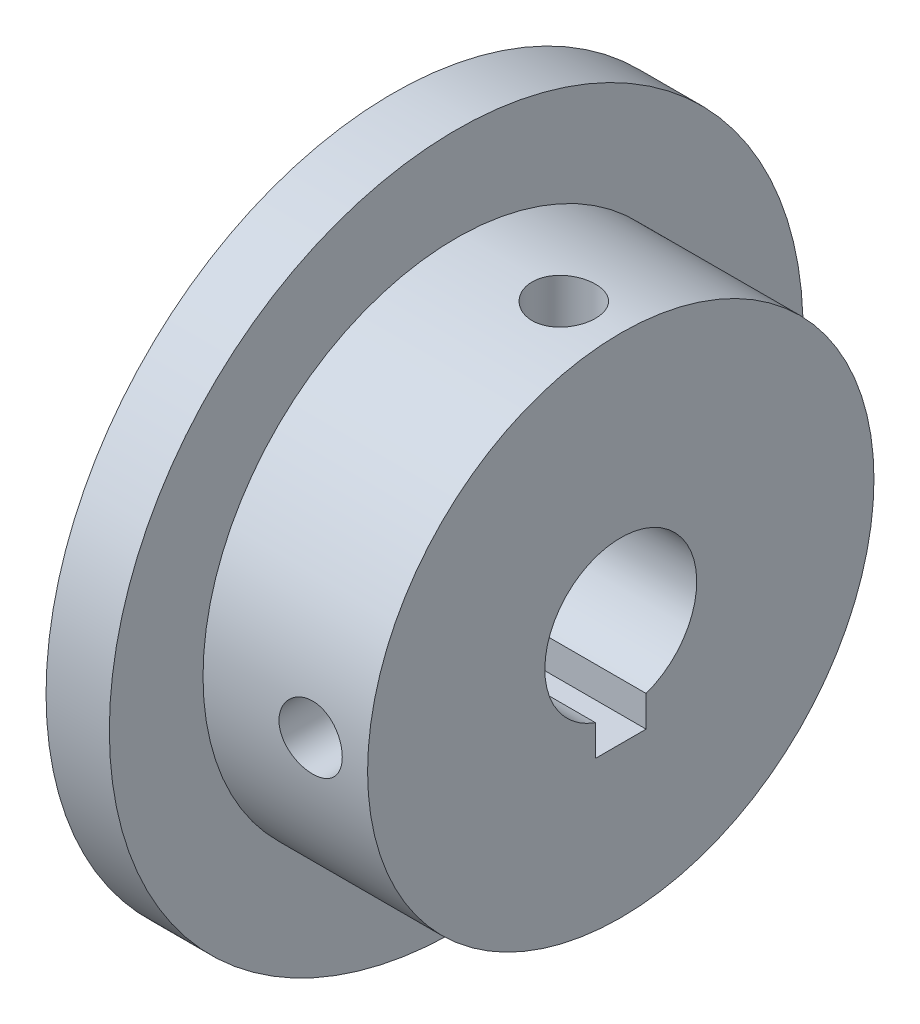
ISO-10303-21;
HEADER;
FILE_DESCRIPTION(('STEP AP214'),'2;1');
FILE_NAME('part.step','',(''),(''),'','','');
FILE_SCHEMA(('AUTOMOTIVE_DESIGN { 1 0 10303 214 1 1 1 1 }'));
ENDSEC;
DATA;
#1=APPLICATION_CONTEXT('core data for automotive mechanical design processes');
#2=APPLICATION_PROTOCOL_DEFINITION('international standard','automotive_design',2000,#1);
#3=PRODUCT_CONTEXT('',#1,'mechanical');
#4=PRODUCT('Part','Part','',(#3));
#5=PRODUCT_RELATED_PRODUCT_CATEGORY('part','',(#4));
#6=PRODUCT_DEFINITION_FORMATION('','',#4);
#7=PRODUCT_DEFINITION_CONTEXT('part definition',#1,'design');
#8=PRODUCT_DEFINITION('design','',#6,#7);
#9=PRODUCT_DEFINITION_SHAPE('','',#8);
#10=(LENGTH_UNIT() NAMED_UNIT(*) SI_UNIT(.MILLI.,.METRE.));
#11=(NAMED_UNIT(*) PLANE_ANGLE_UNIT() SI_UNIT($,.RADIAN.));
#12=(NAMED_UNIT(*) SI_UNIT($,.STERADIAN.) SOLID_ANGLE_UNIT());
#13=UNCERTAINTY_MEASURE_WITH_UNIT(LENGTH_MEASURE(1.E-05),#10,'distance_accuracy_value','');
#14=(GEOMETRIC_REPRESENTATION_CONTEXT(3) GLOBAL_UNCERTAINTY_ASSIGNED_CONTEXT((#13)) GLOBAL_UNIT_ASSIGNED_CONTEXT((#10,
#11,#12)) REPRESENTATION_CONTEXT('',''));
#15=CARTESIAN_POINT('',(0.,0.,0.));
#16=DIRECTION('',(0.,0.,1.));
#17=DIRECTION('',(1.,0.,0.));
#18=AXIS2_PLACEMENT_3D('',#15,#16,#17);
#19=CARTESIAN_POINT('',(0.,0.,0.));
#20=DIRECTION('',(-1.,0.,0.));
#21=DIRECTION('',(0.,0.,1.));
#22=AXIS2_PLACEMENT_3D('',#19,#20,#21);
#23=CYLINDRICAL_SURFACE('',#22,20.);
#24=CARTESIAN_POINT('',(5.,0.,0.));
#25=DIRECTION('',(-1.,0.,0.));
#26=DIRECTION('',(0.,0.,1.));
#27=AXIS2_PLACEMENT_3D('',#24,#25,#26);
#28=CIRCLE('',#27,20.);
#29=CARTESIAN_POINT('',(5.,0.,20.));
#30=VERTEX_POINT('',#29);
#31=EDGE_CURVE('E216',#30,#30,#28,.T.);
#32=ORIENTED_EDGE('',*,*,#31,.F.);
#33=EDGE_LOOP('',(#32));
#34=FACE_BOUND('',#33,.T.);
#35=CARTESIAN_POINT('',(16.,0.,20.));
#36=CARTESIAN_POINT('',(15.9999940590643,-0.139841095555764,19.9999980489643));
#37=CARTESIAN_POINT('',(15.9882271208307,-0.279769574302751,19.998517845549));
#38=CARTESIAN_POINT('',(15.9414722454292,-0.555732802089754,19.9927554011136));
#39=CARTESIAN_POINT('',(15.9064600620766,-0.69176333062374,19.9884702344143));
#40=CARTESIAN_POINT('',(15.8142623560859,-0.955895574813058,19.9775806104441));
#41=CARTESIAN_POINT('',(15.7570917581902,-1.08400256014616,19.9709777145554));
#42=CARTESIAN_POINT('',(15.6222327160302,-1.32877947489305,19.956187008781));
#43=CARTESIAN_POINT('',(15.5445477914693,-1.44545136155637,19.9479994708411));
#44=CARTESIAN_POINT('',(15.3704080501604,-1.66471281693131,19.9309032130632));
#45=CARTESIAN_POINT('',(15.2738628706538,-1.76723036493712,19.9219911469242));
#46=CARTESIAN_POINT('',(15.0649371764634,-1.9546527935575,19.9044772600975));
#47=CARTESIAN_POINT('',(14.9525558550868,-2.03955677639226,19.8958754552427));
#48=CARTESIAN_POINT('',(14.7146800224344,-2.18961016128395,19.8799230561958));
#49=CARTESIAN_POINT('',(14.5891426384321,-2.25469209594108,19.8725767717791));
#50=CARTESIAN_POINT('',(14.3288129480526,-2.36282307657511,19.8600112845768));
#51=CARTESIAN_POINT('',(14.194020992853,-2.40587295806521,19.8547920011314));
#52=CARTESIAN_POINT('',(13.9197558044132,-2.46849898002475,19.8471033960362));
#53=CARTESIAN_POINT('',(13.7803107422958,-2.4881967147317,19.8446198343675));
#54=CARTESIAN_POINT('',(13.5000737365282,-2.50393554955723,19.8426402814279));
#55=CARTESIAN_POINT('',(13.3592818472687,-2.49997760100241,19.8431441700151));
#56=CARTESIAN_POINT('',(13.0811951727512,-2.4686172364479,19.8470695536975));
#57=CARTESIAN_POINT('',(12.9438850137998,-2.44134876298469,19.8504743796033));
#58=CARTESIAN_POINT('',(12.675804978781,-2.36435038318205,19.8597919975763));
#59=CARTESIAN_POINT('',(12.545035235286,-2.31462002175191,19.8657048404572));
#60=CARTESIAN_POINT('',(12.2933320009783,-2.19396555991164,19.8793911586465));
#61=CARTESIAN_POINT('',(12.172426699751,-2.12298325370761,19.8871697321144));
#62=CARTESIAN_POINT('',(11.9441933055867,-1.9618814694569,19.903707114306));
#63=CARTESIAN_POINT('',(11.8368658340263,-1.87176111608078,19.9124659678566));
#64=CARTESIAN_POINT('',(11.6380572892772,-1.67419911075378,19.9300510989043));
#65=CARTESIAN_POINT('',(11.546690908234,-1.56664200783999,19.9388774238689));
#66=CARTESIAN_POINT('',(11.3832911199695,-1.3376571691139,19.9555463255585));
#67=CARTESIAN_POINT('',(11.311257757328,-1.21622940131824,19.9633889000151));
#68=CARTESIAN_POINT('',(11.1885686795361,-0.96286167136348,19.9772115221858));
#69=CARTESIAN_POINT('',(11.1379201461188,-0.830918195337707,19.9831909440154));
#70=CARTESIAN_POINT('',(11.0595295064768,-0.560307940431044,19.9926078578006));
#71=CARTESIAN_POINT('',(11.031786327863,-0.42164147663066,19.9960454687587));
#72=CARTESIAN_POINT('',(11.0001425757395,-0.142513163913496,19.9999759641076));
#73=CARTESIAN_POINT('',(10.996084007636,-0.00206949019860612,20.0004883614264));
#74=CARTESIAN_POINT('',(11.011507734056,0.277496036497497,19.9985633800543));
#75=CARTESIAN_POINT('',(11.0309895272516,0.416617917564708,19.9961260641821));
#76=CARTESIAN_POINT('',(11.0928097087744,0.689124507721518,19.9885876875669));
#77=CARTESIAN_POINT('',(11.1350727634027,0.822526570424695,19.9834954081387));
#78=CARTESIAN_POINT('',(11.2411774519129,1.0803496548584,19.971217231002));
#79=CARTESIAN_POINT('',(11.3050198184914,1.20477037146532,19.9640312622062));
#80=CARTESIAN_POINT('',(11.4528531375074,1.44180452068742,19.9483182291011));
#81=CARTESIAN_POINT('',(11.5369462898056,1.55435375994378,19.9397844404251));
#82=CARTESIAN_POINT('',(11.7227494975342,1.76379698962628,19.9223514232566));
#83=CARTESIAN_POINT('',(11.8244602522509,1.86069035833685,19.913452180269));
#84=CARTESIAN_POINT('',(12.0433074167571,2.03663195881802,19.8962310546259));
#85=CARTESIAN_POINT('',(12.1605283463104,2.11557546056791,19.8879127472133));
#86=CARTESIAN_POINT('',(12.4066582448547,2.25265288944347,19.8728541103715));
#87=CARTESIAN_POINT('',(12.5355669794765,2.31078723372835,19.8661137493103));
#88=CARTESIAN_POINT('',(12.8010753191476,2.40442657886654,19.85499850393));
#89=CARTESIAN_POINT('',(12.937653830048,2.4399906274571,19.8506174518479));
#90=CARTESIAN_POINT('',(13.2149024837807,2.48766999386784,19.8446991590746));
#91=CARTESIAN_POINT('',(13.355572435959,2.49978640253575,19.8431617860878));
#92=CARTESIAN_POINT('',(13.6359689292047,2.50020653608483,19.8431087698246));
#93=CARTESIAN_POINT('',(13.7756952483319,2.48867479769928,19.8445722475195));
#94=CARTESIAN_POINT('',(14.0512071293451,2.44247440484933,19.850311145372));
#95=CARTESIAN_POINT('',(14.1869926908088,2.40780574790577,19.8545865658308));
#96=CARTESIAN_POINT('',(14.4507469567664,2.31636707368966,19.8654611577455));
#97=CARTESIAN_POINT('',(14.5787184450218,2.25960498097094,19.8720594959278));
#98=CARTESIAN_POINT('',(14.8233466540483,2.12560690215032,19.8868378324482));
#99=CARTESIAN_POINT('',(14.9400032330198,2.04837065950959,19.8950178506041));
#100=CARTESIAN_POINT('',(15.1595312253405,1.87500633126583,19.9121060475223));
#101=CARTESIAN_POINT('',(15.262305460955,1.77875562577495,19.9210187208403));
#102=CARTESIAN_POINT('',(15.450306825168,1.57035022696838,19.938528315929));
#103=CARTESIAN_POINT('',(15.5355298107743,1.45819178914157,19.9471251627559));
#104=CARTESIAN_POINT('',(15.6862853571053,1.22066562085422,19.9630705658675));
#105=CARTESIAN_POINT('',(15.7517418058993,1.09524927959618,19.970414250783));
#106=CARTESIAN_POINT('',(15.8605712429163,0.835182902301285,19.9829764907673));
#107=CARTESIAN_POINT('',(15.9039682263534,0.700543080870233,19.9881973536958));
#108=CARTESIAN_POINT('',(15.9570593381713,0.471005771967923,19.9946672032775));
#109=CARTESIAN_POINT('',(15.9731389419821,0.377555663516922,19.9966572589545));
#110=CARTESIAN_POINT('',(15.9946112456933,0.189417063212438,19.9993243132919));
#111=CARTESIAN_POINT('',(16.0000040243993,0.0947285804960287,20.0000013216347));
#112=CARTESIAN_POINT('',(16.,0.,20.));
#113=B_SPLINE_CURVE_WITH_KNOTS('',3,(#35,#36,#37,#38,#39,#40,#41,#42,#43,#44,#45,#46,#47,#48,
#49,#50,#51,#52,#53,#54,#55,#56,#57,#58,#59,#60,#61,#62,#63,#64,#65,#66,#67,#68,#69,#70,#71,#72,
#73,#74,#75,#76,#77,#78,#79,#80,#81,#82,#83,#84,#85,#86,#87,#88,#89,#90,#91,#92,#93,#94,#95,#96,
#97,#98,#99,#100,#101,#102,#103,#104,#105,#106,#107,#108,#109,#110,#111,#112),.UNSPECIFIED.,.T.,
.F.,(4,2,2,2,2,2,2,2,2,2,2,2,2,2,2,2,2,2,2,2,2,2,2,2,2,2,2,2,2,2,2,2,2,2,2,2,2,2,4),(0.,
0.419177272776249,0.838792460943433,1.25812550818178,1.67738665591075,2.09870813201842,
2.52005107800006,2.94281250318869,3.36555789496812,3.78609225286323,4.20660969884662,
4.62472696441691,5.04285270166241,5.46213426285535,5.88143500513641,6.30363478136418,
6.72583553113113,7.14817795731605,7.5705006090378,7.9900027939192,8.40949604501928,
8.82761053893394,9.24573923078945,9.66602402928417,10.0863255137508,10.5090197150757,
10.9317054422154,11.3532807428092,11.7748364301062,12.1934690120221,12.6121016387954,
13.0305842470649,13.4490720991226,13.8703523769183,14.2917319847001,14.7147140303685,
15.1372349868403,15.4211884318763,15.7051397830044),.UNSPECIFIED.);
#114=CARTESIAN_POINT('',(16.,0.,20.));
#115=VERTEX_POINT('',#114);
#116=EDGE_CURVE('E168',#115,#115,#113,.T.);
#117=ORIENTED_EDGE('',*,*,#116,.T.);
#118=EDGE_LOOP('',(#117));
#119=FACE_BOUND('',#118,.T.);
#120=CARTESIAN_POINT('',(13.5,19.8431348329844,2.49999999999993));
#121=CARTESIAN_POINT('',(13.3601637161995,19.8431368414674,2.49999405483331));
#122=CARTESIAN_POINT('',(13.2202400350694,19.8446289499888,2.48822789901652));
#123=CARTESIAN_POINT('',(12.9442867745716,19.8504339085542,2.44147641371659));
#124=CARTESIAN_POINT('',(12.8082614194983,19.8547497060959,2.40646682109074));
#125=CARTESIAN_POINT('',(12.5441401178924,19.8657057380876,2.31427669282767));
#126=CARTESIAN_POINT('',(12.4160388578836,19.8723443946258,2.25711120479866));
#127=CARTESIAN_POINT('',(12.1712715481747,19.8871962351098,2.12226419842898));
#128=CARTESIAN_POINT('',(12.0546035482563,19.8954091498189,2.04458618737457));
#129=CARTESIAN_POINT('',(11.8353377528785,19.9125355924631,1.87045345026445));
#130=CARTESIAN_POINT('',(11.7328131976813,19.9214524170269,1.77390681502425));
#131=CARTESIAN_POINT('',(11.5453772310608,19.9389523287519,1.56497526067112));
#132=CARTESIAN_POINT('',(11.4604666959053,19.9475353992921,1.45258955405795));
#133=CARTESIAN_POINT('',(11.3104064204937,19.96343444613,1.2147098306759));
#134=CARTESIAN_POINT('',(11.2453229549003,19.9707461384685,1.08917369556104));
#135=CARTESIAN_POINT('',(11.137188800059,19.9832423695448,0.82884671805583));
#136=CARTESIAN_POINT('',(11.0941372930735,19.9884269872296,0.694056219360802));
#137=CARTESIAN_POINT('',(11.0315079316656,19.9960616870624,0.419795687751006));
#138=CARTESIAN_POINT('',(11.0118083214761,19.9985259483594,0.280353859663286));
#139=CARTESIAN_POINT('',(10.9960646149634,20.0004906972921,0.000123200686476862));
#140=CARTESIAN_POINT('',(11.0000195880475,19.9999913015208,-0.140665576994832));
#141=CARTESIAN_POINT('',(11.0313752027574,19.9960964777001,-0.418765268974607));
#142=CARTESIAN_POINT('',(11.0586448984814,19.9927172245573,-0.556091205764519));
#143=CARTESIAN_POINT('',(11.1356511766299,19.9834605594233,-0.82420216390545));
#144=CARTESIAN_POINT('',(11.1853881861668,19.9775830999405,-0.95498706085628));
#145=CARTESIAN_POINT('',(11.3060564927838,19.9639625780791,-1.20670881543872));
#146=CARTESIAN_POINT('',(11.3770444577302,19.9562145384324,-1.3276182278406));
#147=CARTESIAN_POINT('',(11.538158362216,19.9397196906528,-1.55585745230654));
#148=CARTESIAN_POINT('',(11.6282851794686,19.9309728367226,-1.66318664121741));
#149=CARTESIAN_POINT('',(11.8258518185984,19.9133886752351,-1.861988030773));
#150=CARTESIAN_POINT('',(11.9334057595467,19.9045511580473,-1.95334683999607));
#151=CARTESIAN_POINT('',(12.1623815567825,19.8878407194058,-2.11673285062519));
#152=CARTESIAN_POINT('',(12.2838034565381,19.8799678009758,-2.18875999143516));
#153=CARTESIAN_POINT('',(12.5371694955624,19.8660780261272,-2.3114445735828));
#154=CARTESIAN_POINT('',(12.6691180799532,19.8600619590813,-2.36209292986241));
#155=CARTESIAN_POINT('',(12.9397394535268,19.8505824249596,-2.44048165446817));
#156=CARTESIAN_POINT('',(13.0784119183087,19.847118834867,-2.46822312679968));
#157=CARTESIAN_POINT('',(13.3575431819998,19.8431588878405,-2.49986043190866));
#158=CARTESIAN_POINT('',(13.4979836230888,19.8426426744238,-2.50391584199836));
#159=CARTESIAN_POINT('',(13.7775419296654,19.8445834111965,-2.48848695323063));
#160=CARTESIAN_POINT('',(13.9166598232793,19.8470402980145,-2.46900315610988));
#161=CARTESIAN_POINT('',(14.1891457635778,19.8546322848399,-2.40718328579779));
#162=CARTESIAN_POINT('',(14.3225316151904,19.8597583269466,-2.36492448374614));
#163=CARTESIAN_POINT('',(14.5803241548531,19.8721036997081,-2.2588337191162));
#164=CARTESIAN_POINT('',(14.7047305272409,19.8793231039076,-2.19500099858128));
#165=CARTESIAN_POINT('',(14.941754643813,19.8950893135323,-2.04718202215497));
#166=CARTESIAN_POINT('',(15.0543066653144,19.9036429273708,-1.96309111957716));
#167=CARTESIAN_POINT('',(15.263756553935,19.9210923955102,-1.77729074236902));
#168=CARTESIAN_POINT('',(15.360653811868,19.9299882631129,-1.67558058242556));
#169=CARTESIAN_POINT('',(15.5366041873344,19.9471808868696,-1.45673177555859));
#170=CARTESIAN_POINT('',(15.615552446795,19.9554739391252,-1.33950849211709));
#171=CARTESIAN_POINT('',(15.7526382176338,19.9704711303161,-1.09337258168184));
#172=CARTESIAN_POINT('',(15.810776148481,19.9771753012772,-0.964460190368393));
#173=CARTESIAN_POINT('',(15.9044177869081,19.9882229065319,-0.698953859139531));
#174=CARTESIAN_POINT('',(15.9399820960316,19.992572656877,-0.562381566511845));
#175=CARTESIAN_POINT('',(15.9876640892267,19.9984475467757,-0.285146057278021));
#176=CARTESIAN_POINT('',(15.9997828305992,19.9999728137019,-0.144483025438173));
#177=CARTESIAN_POINT('',(16.0002099222921,20.0000262801365,0.135917183343715));
#178=CARTESIAN_POINT('',(15.988679960568,19.998574831678,0.275654137714667));
#179=CARTESIAN_POINT('',(15.9424793865691,19.9928784115798,0.551187741452566));
#180=CARTESIAN_POINT('',(15.9078087903881,19.9886334418829,0.686984393559821));
#181=CARTESIAN_POINT('',(15.8163618856503,19.9778248521189,0.950761442987222));
#182=CARTESIAN_POINT('',(15.759593320627,19.9712620443393,1.07874456015939));
#183=CARTESIAN_POINT('',(15.6255786853922,19.9565444760682,1.32339333714406));
#184=CARTESIAN_POINT('',(15.5483323717374,19.9483896966512,1.44005886238836));
#185=CARTESIAN_POINT('',(15.3749567846645,19.9313319392356,1.65958676796206));
#186=CARTESIAN_POINT('',(15.2787072064796,19.9224244127137,1.76235378783267));
#187=CARTESIAN_POINT('',(15.0703070559678,19.9049015902109,1.95034111882079));
#188=CARTESIAN_POINT('',(14.9581527224968,19.8962863639518,2.03555726779914));
#189=CARTESIAN_POINT('',(14.720630077313,19.8802881136638,2.18630524251146));
#190=CARTESIAN_POINT('',(14.5952124101068,19.8729099764648,2.25175978314734));
#191=CARTESIAN_POINT('',(14.3351432594474,19.8602785801803,2.36058528832407));
#192=CARTESIAN_POINT('',(14.2005020007076,19.8550230113382,2.40398027122386));
#193=CARTESIAN_POINT('',(13.9709700129508,19.8485078683333,2.45706589624043));
#194=CARTESIAN_POINT('',(13.8775270484602,19.8465030152112,2.47314303101103));
#195=CARTESIAN_POINT('',(13.6894027500352,19.8438158223071,2.4946120559049));
#196=CARTESIAN_POINT('',(13.5947214255021,19.8431334724909,2.50000402709964));
#197=CARTESIAN_POINT('',(13.5,19.8431348329844,2.49999999999993));
#198=B_SPLINE_CURVE_WITH_KNOTS('',3,(#120,#121,#122,#123,#124,#125,#126,#127,#128,#129,#130,
#131,#132,#133,#134,#135,#136,#137,#138,#139,#140,#141,#142,#143,#144,#145,#146,#147,#148,#149,
#150,#151,#152,#153,#154,#155,#156,#157,#158,#159,#160,#161,#162,#163,#164,#165,#166,#167,#168,
#169,#170,#171,#172,#173,#174,#175,#176,#177,#178,#179,#180,#181,#182,#183,#184,#185,#186,#187,
#188,#189,#190,#191,#192,#193,#194,#195,#196,#197),.UNSPECIFIED.,.T.,.F.,(4,2,2,2,2,2,2,2,2,2,2,
2,2,2,2,2,2,2,2,2,2,2,2,2,2,2,2,2,2,2,2,2,2,2,2,2,2,2,4),(0.,0.419162817491639,
0.838763876176467,1.25808045260531,1.67732537953026,2.09866577551479,2.52002712744991,
2.94278186148154,3.36552090342245,3.7860459694387,4.20655449172518,4.6247166493545,
5.04288675674202,5.46218204415216,5.88149656471515,6.30367697380182,6.72585870621839,
7.14821966741422,7.570560271586,7.99005217808293,8.40953514329524,8.82760376295143,
9.24568707214265,9.66597819546523,10.0862856699722,10.5089888589475,10.9316835271129,
11.3532385678735,11.7747745977522,12.1934381629067,12.612101436892,13.030618135465,
13.4491398096666,13.8704012889324,14.2917625544224,14.7147509770793,15.1372778598593,
15.4212098963687,15.7051397785939),.UNSPECIFIED.);
#199=CARTESIAN_POINT('',(13.5,19.8431348329844,2.49999999999993));
#200=VERTEX_POINT('',#199);
#201=EDGE_CURVE('E123',#200,#200,#198,.T.);
#202=ORIENTED_EDGE('',*,*,#201,.T.);
#203=EDGE_LOOP('',(#202));
#204=FACE_BOUND('',#203,.T.);
#205=CARTESIAN_POINT('',(18.,0.,0.));
#206=DIRECTION('',(1.,0.,0.));
#207=DIRECTION('',(0.,0.,-1.));
#208=AXIS2_PLACEMENT_3D('',#205,#206,#207);
#209=CIRCLE('',#208,20.);
#210=CARTESIAN_POINT('',(18.,0.,-20.));
#211=VERTEX_POINT('',#210);
#212=EDGE_CURVE('E105',#211,#211,#209,.T.);
#213=ORIENTED_EDGE('',*,*,#212,.F.);
#214=EDGE_LOOP('',(#213));
#215=FACE_BOUND('',#214,.T.);
#216=ADVANCED_FACE('F55',(#34,#119,#204,#215),#23,.T.);
#217=CARTESIAN_POINT('',(22.,0.,0.));
#218=DIRECTION('',(-1.,0.,0.));
#219=DIRECTION('',(0.,0.,1.));
#220=AXIS2_PLACEMENT_3D('',#217,#218,#219);
#221=CYLINDRICAL_SURFACE('',#220,6.);
#222=CARTESIAN_POINT('',(16.,0.,6.00000000000001));
#223=CARTESIAN_POINT('',(15.9999952878603,0.133903918163792,5.99999628290905));
#224=CARTESIAN_POINT('',(15.9891786843995,0.268039524991429,5.99546656821165));
#225=CARTESIAN_POINT('',(15.9463192619064,0.532498019991115,5.97780115788619));
#226=CARTESIAN_POINT('',(15.9142210532185,0.662810029808664,5.96464300599791));
#227=CARTESIAN_POINT('',(15.8301785119407,0.915376593299222,5.93112629106012));
#228=CARTESIAN_POINT('',(15.7783014076769,1.03765681434385,5.9107921364203));
#229=CARTESIAN_POINT('',(15.6564541669782,1.27165974779734,5.86490559253452));
#230=CARTESIAN_POINT('',(15.5864895110253,1.38338564416287,5.83935478441348));
#231=CARTESIAN_POINT('',(15.4267420881925,1.59889674004597,5.78415660619866));
#232=CARTESIAN_POINT('',(15.3361973967483,1.70208251703042,5.75437507703434));
#233=CARTESIAN_POINT('',(15.1394713160996,1.8923196601971,5.69465427085229));
#234=CARTESIAN_POINT('',(15.0332817462849,1.97936253123989,5.66471491925558));
#235=CARTESIAN_POINT('',(14.8019464489895,2.13907474876483,5.60642043928223));
#236=CARTESIAN_POINT('',(14.6761251042486,2.21082616169411,5.578215738276));
#237=CARTESIAN_POINT('',(14.4128534830571,2.331878813161,5.52871144633223));
#238=CARTESIAN_POINT('',(14.2754092407429,2.38119161708798,5.507408299805));
#239=CARTESIAN_POINT('',(13.9996926167385,2.45349196589844,5.47557110795536));
#240=CARTESIAN_POINT('',(13.861779033289,2.47763315746001,5.46456775308953));
#241=CARTESIAN_POINT('',(13.5834534145536,2.50250419944798,5.45322652433635));
#242=CARTESIAN_POINT('',(13.4430427999297,2.50324696111169,5.45288276849133));
#243=CARTESIAN_POINT('',(13.1751998791476,2.48216900725155,5.46250239122986));
#244=CARTESIAN_POINT('',(13.0475978068758,2.46207362224015,5.47167765447589));
#245=CARTESIAN_POINT('',(12.7977758179946,2.40278382032142,5.49796965547251));
#246=CARTESIAN_POINT('',(12.6755569370153,2.36358574574512,5.51508791407035));
#247=CARTESIAN_POINT('',(12.4368845940185,2.26643917454979,5.55572369545609));
#248=CARTESIAN_POINT('',(12.3206091581737,2.20810943078429,5.579369638983));
#249=CARTESIAN_POINT('',(12.0990445322394,2.0746248516117,5.63036662282147));
#250=CARTESIAN_POINT('',(11.9937596987729,1.99946338103922,5.6577191225955));
#251=CARTESIAN_POINT('',(11.7878000825344,1.82699193108754,5.71585953755965));
#252=CARTESIAN_POINT('',(11.6882668652292,1.72834696641501,5.74674242808949));
#253=CARTESIAN_POINT('',(11.5067729940816,1.51545918210305,5.80651346225059));
#254=CARTESIAN_POINT('',(11.4248164566156,1.40121271889692,5.83540113754019));
#255=CARTESIAN_POINT('',(11.2791283527675,1.15689589738675,5.88876567112946));
#256=CARTESIAN_POINT('',(11.2158611096987,1.02652116489536,5.91312533086669));
#257=CARTESIAN_POINT('',(11.1125577207935,0.755704805053668,5.95378962829607));
#258=CARTESIAN_POINT('',(11.0725087361124,0.615268789590072,5.97009871691598));
#259=CARTESIAN_POINT('',(11.0191680157468,0.337856226692458,5.99199282372767));
#260=CARTESIAN_POINT('',(11.0043442851125,0.201222570557282,5.99819082094251));
#261=CARTESIAN_POINT('',(10.9973075527718,-0.0727093109921744,6.00112100737491));
#262=CARTESIAN_POINT('',(11.005088059496,-0.210007334305269,5.99785591423878));
#263=CARTESIAN_POINT('',(11.0419421696121,-0.474196484682866,5.98262435313881));
#264=CARTESIAN_POINT('',(11.0699399081944,-0.601265933278767,5.97109774567981));
#265=CARTESIAN_POINT('',(11.1449363890816,-0.84876549794217,5.9409721354483));
#266=CARTESIAN_POINT('',(11.1919375319006,-0.969194773036708,5.92237223919407));
#267=CARTESIAN_POINT('',(11.3051419514242,-1.20421799973828,5.87916541290329));
#268=CARTESIAN_POINT('',(11.3718963662921,-1.31851447371067,5.85438982938562));
#269=CARTESIAN_POINT('',(11.5221067555834,-1.53469243246281,5.80147609158185));
#270=CARTESIAN_POINT('',(11.6055697030586,-1.63656870520375,5.77333653537474));
#271=CARTESIAN_POINT('',(11.7938064665447,-1.83266686054867,5.71424175790868));
#272=CARTESIAN_POINT('',(11.8996770059721,-1.92582139596022,5.6832290318203));
#273=CARTESIAN_POINT('',(12.1260425518712,-2.09333969221045,5.62368673536042));
#274=CARTESIAN_POINT('',(12.246540870345,-2.16769918571026,5.59515772986988));
#275=CARTESIAN_POINT('',(12.5012283506036,-2.29631920417609,5.54362772487865));
#276=CARTESIAN_POINT('',(12.6355880710238,-2.3502783647545,5.52071125109804));
#277=CARTESIAN_POINT('',(12.9127411876261,-2.43434827902352,5.48416711318336));
#278=CARTESIAN_POINT('',(13.0555275249888,-2.46447869724417,5.47053179113073));
#279=CARTESIAN_POINT('',(13.333637398378,-2.49808160700531,5.45526329073079));
#280=CARTESIAN_POINT('',(13.4686893245119,-2.50342760836084,5.45278701929115));
#281=CARTESIAN_POINT('',(13.7376857223555,-2.49231151038,5.45787706027261));
#282=CARTESIAN_POINT('',(13.8716303609001,-2.47585275892878,5.46544183100008));
#283=CARTESIAN_POINT('',(14.1281854946777,-2.42316809595844,5.48899102586044));
#284=CARTESIAN_POINT('',(14.2510333459775,-2.38789807270204,5.50456709625454));
#285=CARTESIAN_POINT('',(14.489096043664,-2.29952656276964,5.54206362465905));
#286=CARTESIAN_POINT('',(14.604308734336,-2.24642006560089,5.56398586515028));
#287=CARTESIAN_POINT('',(14.831391788147,-2.1202057237392,5.61333908853254));
#288=CARTESIAN_POINT('',(14.9426446459478,-2.04608723750138,5.6410220440408));
#289=CARTESIAN_POINT('',(15.1517202931151,-1.8813681259624,5.69807379131315));
#290=CARTESIAN_POINT('',(15.2495384050324,-1.79076178563715,5.72744316520043));
#291=CARTESIAN_POINT('',(15.4362973056175,-1.58780416898837,5.78712781593092));
#292=CARTESIAN_POINT('',(15.5240726428278,-1.47434977868814,5.81735619175012));
#293=CARTESIAN_POINT('',(15.6793991300421,-1.23319985958044,5.87320303099822));
#294=CARTESIAN_POINT('',(15.7469410639969,-1.1054978774169,5.89881939160168));
#295=CARTESIAN_POINT('',(15.8584188704517,-0.841465213422198,5.94218308378892));
#296=CARTESIAN_POINT('',(15.9027264942901,-0.705312056415875,5.9600534904466));
#297=CARTESIAN_POINT('',(15.9674156875296,-0.426816782070274,5.98642234975891));
#298=CARTESIAN_POINT('',(15.9878721682057,-0.28449550612199,5.9949501404242));
#299=CARTESIAN_POINT('',(15.9973238417862,-0.11805251234944,5.99888566614292));
#300=CARTESIAN_POINT('',(15.998326602503,-0.0944569348794046,5.99930292614999));
#301=CARTESIAN_POINT('',(15.9996650982568,-0.0472433090693372,5.99986042138658));
#302=CARTESIAN_POINT('',(16.0000008313836,-0.023625260665151,6.00000065582281));
#303=CARTESIAN_POINT('',(16.,0.,6.00000000000001));
#304=B_SPLINE_CURVE_WITH_KNOTS('',3,(#222,#223,#224,#225,#226,#227,#228,#229,#230,#231,#232,
#233,#234,#235,#236,#237,#238,#239,#240,#241,#242,#243,#244,#245,#246,#247,#248,#249,#250,#251,
#252,#253,#254,#255,#256,#257,#258,#259,#260,#261,#262,#263,#264,#265,#266,#267,#268,#269,#270,
#271,#272,#273,#274,#275,#276,#277,#278,#279,#280,#281,#282,#283,#284,#285,#286,#287,#288,#289,
#290,#291,#292,#293,#294,#295,#296,#297,#298,#299,#300,#301,#302,#303),.UNSPECIFIED.,.T.,.F.,(4,
2,2,2,2,2,2,2,2,2,2,2,2,2,2,2,2,2,2,2,2,2,2,2,2,2,2,2,2,2,2,2,2,2,2,2,2,2,2,2,4),(0.,
0.401613837767878,0.804277081257397,1.2055837038126,1.60676887370594,2.02635872577614,
2.44616876262931,2.88663449078251,3.32687293461177,3.74590546275115,4.16470676498089,
4.55140314405107,4.93817359454417,5.33317426117426,5.72833091434413,6.15688282255793,
6.58553498629176,7.02408110121625,7.46238448436592,7.872968867865,8.28343534986342,
8.67353179471441,9.06367753203568,9.4659427054432,9.86837610938989,10.2995697605859,
10.7308612248068,11.1682957671904,11.6053689414916,12.0087975511928,12.4121642259507,
12.7967529992952,13.1814498990122,13.5892778679488,13.9972474685188,14.4349307000978,
14.8728129885716,15.3034571163877,15.7327450093864,15.8036033125921,15.8744618187069),.UNSPECIFIED.);
#305=CARTESIAN_POINT('',(16.,0.,6.00000000000001));
#306=VERTEX_POINT('',#305);
#307=EDGE_CURVE('E174',#306,#306,#304,.T.);
#308=ORIENTED_EDGE('',*,*,#307,.T.);
#309=EDGE_LOOP('',(#308));
#310=FACE_BOUND('',#309,.T.);
#311=CARTESIAN_POINT('',(13.5,5.45435605731787,2.5));
#312=CARTESIAN_POINT('',(13.5667081831549,5.45435734054168,2.49999850025921));
#313=CARTESIAN_POINT('',(13.6334347921685,5.45558543290002,2.49732449538891));
#314=CARTESIAN_POINT('',(13.766386478403,5.46045125759503,2.48666416485589));
#315=CARTESIAN_POINT('',(13.8326112338951,5.46409042196576,2.47867468210211));
#316=CARTESIAN_POINT('',(14.0300518667706,5.478484908172,2.4467926593159));
#317=CARTESIAN_POINT('',(14.1598368164295,5.49271671920564,2.41498683408237));
#318=CARTESIAN_POINT('',(14.4111547641313,5.52853615769557,2.33180001337597));
#319=CARTESIAN_POINT('',(14.5327190520916,5.55009376241036,2.28049881438594));
#320=CARTESIAN_POINT('',(14.765510176557,5.59808356001867,2.16001268934733));
#321=CARTESIAN_POINT('',(14.8767394499768,5.62451459938575,2.09083199376534));
#322=CARTESIAN_POINT('',(15.0926539820895,5.68111508149861,1.93194778443697));
#323=CARTESIAN_POINT('',(15.1966157970475,5.71141131571834,1.84130648149058));
#324=CARTESIAN_POINT('',(15.3883997651745,5.77128595332679,1.64404334636726));
#325=CARTESIAN_POINT('',(15.4762156955112,5.80086407615,1.53741538134825));
#326=CARTESIAN_POINT('',(15.6368992555287,5.8575107455344,1.30552678905511));
#327=CARTESIAN_POINT('',(15.7089533078815,5.88441479600862,1.17965858775783));
#328=CARTESIAN_POINT('',(15.8305519892174,5.93113040336417,0.916264044334303));
#329=CARTESIAN_POINT('',(15.8801066103974,5.95094510785638,0.778742909642231));
#330=CARTESIAN_POINT('',(15.9526789303403,5.98035041998162,0.50353699614698));
#331=CARTESIAN_POINT('',(15.9769433932332,5.99041942231786,0.366233152417984));
#332=CARTESIAN_POINT('',(16.002275278892,6.00093657245547,0.0891583607041506));
#333=CARTESIAN_POINT('',(16.0033521108742,6.00138862268061,-0.0506115635357898));
#334=CARTESIAN_POINT('',(15.9829314389708,5.99290258260449,-0.319585560218837));
#335=CARTESIAN_POINT('',(15.9628037991731,5.98453429295767,-0.448914977212918));
#336=CARTESIAN_POINT('',(15.9028937944991,5.96013033502178,-0.702165787864676));
#337=CARTESIAN_POINT('',(15.8631099806788,5.94409410149731,-0.826086782110481));
#338=CARTESIAN_POINT('',(15.7645439182725,5.9055970482747,-1.06727623615447));
#339=CARTESIAN_POINT('',(15.7054810742757,5.88304194251413,-1.18441435414912));
#340=CARTESIAN_POINT('',(15.5703084865819,5.83371427980365,-1.40742353456469));
#341=CARTESIAN_POINT('',(15.4941927183021,5.80694023334947,-1.51329059551626));
#342=CARTESIAN_POINT('',(15.3208351591992,5.74963397551512,-1.71868182341343));
#343=CARTESIAN_POINT('',(15.2224824174569,5.7189698870208,-1.81723287462322));
#344=CARTESIAN_POINT('',(15.0105771185718,5.6587572137288,-1.99686282986467));
#345=CARTESIAN_POINT('',(14.8970187233643,5.62920906299901,-2.07793499168342));
#346=CARTESIAN_POINT('',(14.6532099267203,5.57363224672087,-2.22280378497077));
#347=CARTESIAN_POINT('',(14.5225335886945,5.54775116967601,-2.28594506698399));
#348=CARTESIAN_POINT('',(14.2510379102374,5.50419688296716,-2.38892864103961));
#349=CARTESIAN_POINT('',(14.1102259035158,5.48651780631502,-2.42878759251238));
#350=CARTESIAN_POINT('',(13.832206382133,5.46282425074791,-2.48160050339179));
#351=CARTESIAN_POINT('',(13.6953577554715,5.4561273840368,-2.49613229266519));
#352=CARTESIAN_POINT('',(13.4210430351874,5.45320573611838,-2.50251261037215));
#353=CARTESIAN_POINT('',(13.2835771716193,5.45697733196184,-2.49436898636096));
#354=CARTESIAN_POINT('',(13.0212032291366,5.47386262693794,-2.45706955131305));
#355=CARTESIAN_POINT('',(12.8960546264258,5.4863627603385,-2.42929237636151));
#356=CARTESIAN_POINT('',(12.6522974070049,5.51851260594275,-2.35534117128403));
#357=CARTESIAN_POINT('',(12.5336903263385,5.53816398920151,-2.30916284106238));
#358=CARTESIAN_POINT('',(12.3007693792872,5.58341595714177,-2.19755041610387));
#359=CARTESIAN_POINT('',(12.1868500507806,5.60923324404615,-2.13138366612396));
#360=CARTESIAN_POINT('',(11.9711838950007,5.66360007481533,-1.982401568772));
#361=CARTESIAN_POINT('',(11.8694423665913,5.69215079841132,-1.89957901575223));
#362=CARTESIAN_POINT('',(11.6723997302374,5.75157239569101,-1.71168891143075));
#363=CARTESIAN_POINT('',(11.5782972001196,5.78244293417773,-1.60535932295845));
#364=CARTESIAN_POINT('',(11.4090554160204,5.84086722367754,-1.3777030251082));
#365=CARTESIAN_POINT('',(11.3339175517942,5.86842073153699,-1.25637521761136));
#366=CARTESIAN_POINT('',(11.2048202491916,5.91728503171628,-1.00130936160272));
#367=CARTESIAN_POINT('',(11.1509155177152,5.93857966278875,-0.8675403392619));
#368=CARTESIAN_POINT('',(11.0667664150371,5.9723634620551,-0.59171767032395));
#369=CARTESIAN_POINT('',(11.036507962451,5.98485787035281,-0.449669008506765));
#370=CARTESIAN_POINT('',(11.0022837499796,5.99903069599259,-0.172033066960368));
#371=CARTESIAN_POINT('',(10.9966280042899,6.0014040908376,-0.0366881693984296));
#372=CARTESIAN_POINT('',(11.0072262789047,5.99699046946599,0.232973623239222));
#373=CARTESIAN_POINT('',(11.023476458314,5.99020505911644,0.36729069437745));
#374=CARTESIAN_POINT('',(11.0762121575427,5.9686013201843,0.626172965578169));
#375=CARTESIAN_POINT('',(11.1119594094758,5.95407648620171,0.750915078182066));
#376=CARTESIAN_POINT('',(11.2018684458724,5.91858999492375,0.992584458507217));
#377=CARTESIAN_POINT('',(11.2560337283582,5.8976271149635,1.10951023666907));
#378=CARTESIAN_POINT('',(11.3839792475792,5.85011651583377,1.3380491406805));
#379=CARTESIAN_POINT('',(11.458535323513,5.823359213724,1.44918335299797));
#380=CARTESIAN_POINT('',(11.6240136448107,5.76743120752481,1.65783731421914));
#381=CARTESIAN_POINT('',(11.7149419658362,5.73825960968077,1.75535198504108));
#382=CARTESIAN_POINT('',(11.9178925300721,5.67829702479814,1.94089972242286));
#383=CARTESIAN_POINT('',(12.03092911203,5.64753091772369,2.02783607699355));
#384=CARTESIAN_POINT('',(12.2709063920008,5.5899105903639,2.18166607575476));
#385=CARTESIAN_POINT('',(12.3978548086674,5.56305856115974,2.24854851583745));
#386=CARTESIAN_POINT('',(12.6619289333595,5.51685287460304,2.35965744264201));
#387=CARTESIAN_POINT('',(12.7989959551496,5.49745949216626,2.40400437258693));
#388=CARTESIAN_POINT('',(13.0091637690664,5.47594959049766,2.45239925350776));
#389=CARTESIAN_POINT('',(13.0799105979561,5.47004503557759,2.46550603347806));
#390=CARTESIAN_POINT('',(13.2224260564186,5.4609537346621,2.48558130943925));
#391=CARTESIAN_POINT('',(13.2941939279226,5.45776506941947,2.49255414024393));
#392=CARTESIAN_POINT('',(13.410711605639,5.4549039172767,2.49880479670821));
#393=CARTESIAN_POINT('',(13.4553516756734,5.45435519844585,2.50000100378858));
#394=CARTESIAN_POINT('',(13.5,5.45435605731787,2.5));
#395=B_SPLINE_CURVE_WITH_KNOTS('',3,(#311,#312,#313,#314,#315,#316,#317,#318,#319,#320,#321,
#322,#323,#324,#325,#326,#327,#328,#329,#330,#331,#332,#333,#334,#335,#336,#337,#338,#339,#340,
#341,#342,#343,#344,#345,#346,#347,#348,#349,#350,#351,#352,#353,#354,#355,#356,#357,#358,#359,
#360,#361,#362,#363,#364,#365,#366,#367,#368,#369,#370,#371,#372,#373,#374,#375,#376,#377,#378,
#379,#380,#381,#382,#383,#384,#385,#386,#387,#388,#389,#390,#391,#392,#393,#394),.UNSPECIFIED.,
.T.,.F.,(4,2,2,2,2,2,2,2,2,2,2,2,2,2,2,2,2,2,2,2,2,2,2,2,2,2,2,2,2,2,2,2,2,2,2,2,2,2,2,2,2,4),
(0.,0.200084575093048,0.400288095243593,0.801278994956937,1.20064597557682,1.5999185483728,
2.02172149988567,2.4436866804708,2.88395420283105,3.32402600677038,3.7411967908316,
4.15819828963116,4.54982147617442,4.94147353531024,5.33910096407388,5.73686909172226,
6.16267530816226,6.58864548009989,7.02861558463918,7.46827048625631,7.87940023747109,
8.29038772171391,8.67506269266877,9.05982760961552,9.46088720770832,9.86212068725424,
10.2960179260552,10.7299469521822,11.1649867904569,11.5997673642051,12.004157373226,
12.4084764873832,12.7984529720747,13.1885035639884,13.5961819279257,14.004011892323,
14.4395932095167,14.8754174341574,15.3088871873109,15.5252058174741,15.7413714538654,
15.8752896716762),.UNSPECIFIED.);
#396=CARTESIAN_POINT('',(13.5,5.45435605731787,2.5));
#397=VERTEX_POINT('',#396);
#398=EDGE_CURVE('E112',#397,#397,#395,.T.);
#399=ORIENTED_EDGE('',*,*,#398,.T.);
#400=EDGE_LOOP('',(#399));
#401=FACE_BOUND('',#400,.T.);
#402=CARTESIAN_POINT('',(18.,0.,0.));
#403=DIRECTION('',(1.,0.,0.));
#404=DIRECTION('',(0.,0.,-1.));
#405=AXIS2_PLACEMENT_3D('',#402,#403,#404);
#406=CIRCLE('',#405,6.);
#407=CARTESIAN_POINT('',(18.,-5.65685424949238,2.));
#408=VERTEX_POINT('',#407);
#409=CARTESIAN_POINT('',(18.,-5.65685424949238,-2.00000000000001));
#410=VERTEX_POINT('',#409);
#411=EDGE_CURVE('E69',#408,#410,#406,.F.);
#412=ORIENTED_EDGE('',*,*,#411,.F.);
#413=DIRECTION('',(-1.,0.,0.));
#414=VECTOR('',#413,1.);
#415=CARTESIAN_POINT('',(22.,-5.65685424949238,2.00000000000001));
#416=LINE('',#415,#414);
#417=CARTESIAN_POINT('',(0.,-5.65685424949238,1.99999999999999));
#418=VERTEX_POINT('',#417);
#419=EDGE_CURVE('E204',#418,#408,#416,.F.);
#420=ORIENTED_EDGE('',*,*,#419,.F.);
#421=CARTESIAN_POINT('',(0.,0.,0.));
#422=DIRECTION('',(-1.,0.,0.));
#423=DIRECTION('',(0.,0.,1.));
#424=AXIS2_PLACEMENT_3D('',#421,#422,#423);
#425=CIRCLE('',#424,6.);
#426=CARTESIAN_POINT('',(0.,-5.65685424949238,-1.99999999999999));
#427=VERTEX_POINT('',#426);
#428=EDGE_CURVE('E173',#418,#427,#425,.T.);
#429=ORIENTED_EDGE('',*,*,#428,.T.);
#430=DIRECTION('',(-1.,0.,0.));
#431=VECTOR('',#430,1.);
#432=CARTESIAN_POINT('',(22.,-5.65685424949238,-2.00000000000001));
#433=LINE('',#432,#431);
#434=EDGE_CURVE('E76',#410,#427,#433,.T.);
#435=ORIENTED_EDGE('',*,*,#434,.F.);
#436=EDGE_LOOP('',(#412,#420,#429,#435));
#437=FACE_BOUND('',#436,.T.);
#438=ADVANCED_FACE('F140',(#310,#401,#437),#221,.F.);
#439=CARTESIAN_POINT('',(22.001,-8.1,2.00000000000001));
#440=DIRECTION('',(0.,0.,1.));
#441=DIRECTION('',(0.,-1.,0.));
#442=AXIS2_PLACEMENT_3D('',#439,#440,#441);
#443=PLANE('',#442);
#444=DIRECTION('',(0.,1.,0.));
#445=VECTOR('',#444,1.);
#446=CARTESIAN_POINT('',(18.,-8.1,2.00000000000001));
#447=LINE('',#446,#445);
#448=CARTESIAN_POINT('',(18.,-8.1,2.00000000000001));
#449=VERTEX_POINT('',#448);
#450=EDGE_CURVE('E104',#449,#408,#447,.T.);
#451=ORIENTED_EDGE('',*,*,#450,.F.);
#452=DIRECTION('',(-1.,0.,0.));
#453=VECTOR('',#452,1.);
#454=CARTESIAN_POINT('',(22.001,-8.1,2.00000000000001));
#455=LINE('',#454,#453);
#456=CARTESIAN_POINT('',(0.,-8.1,1.99999999999999));
#457=VERTEX_POINT('',#456);
#458=EDGE_CURVE('E103',#449,#457,#455,.T.);
#459=ORIENTED_EDGE('',*,*,#458,.T.);
#460=DIRECTION('',(0.,1.,0.));
#461=VECTOR('',#460,1.);
#462=CARTESIAN_POINT('',(0.,-8.1,1.99999999999999));
#463=LINE('',#462,#461);
#464=EDGE_CURVE('E207',#457,#418,#463,.T.);
#465=ORIENTED_EDGE('',*,*,#464,.T.);
#466=ORIENTED_EDGE('',*,*,#419,.T.);
#467=EDGE_LOOP('',(#451,#459,#465,#466));
#468=FACE_BOUND('',#467,.T.);
#469=ADVANCED_FACE('F136',(#468),#443,.F.);
#470=CARTESIAN_POINT('',(22.001,-8.1,-1.99999999999999));
#471=DIRECTION('',(0.,-1.,0.));
#472=DIRECTION('',(0.,0.,-1.));
#473=AXIS2_PLACEMENT_3D('',#470,#471,#472);
#474=PLANE('',#473);
#475=DIRECTION('',(0.,0.,1.));
#476=VECTOR('',#475,1.);
#477=CARTESIAN_POINT('',(18.,-8.1,-1.99999999999999));
#478=LINE('',#477,#476);
#479=CARTESIAN_POINT('',(18.,-8.1,-1.99999999999999));
#480=VERTEX_POINT('',#479);
#481=EDGE_CURVE('E95',#480,#449,#478,.T.);
#482=ORIENTED_EDGE('',*,*,#481,.F.);
#483=DIRECTION('',(-1.,0.,0.));
#484=VECTOR('',#483,1.);
#485=CARTESIAN_POINT('',(22.001,-8.1,-1.99999999999999));
#486=LINE('',#485,#484);
#487=CARTESIAN_POINT('',(0.,-8.1,-1.99999999999999));
#488=VERTEX_POINT('',#487);
#489=EDGE_CURVE('E102',#480,#488,#486,.T.);
#490=ORIENTED_EDGE('',*,*,#489,.T.);
#491=DIRECTION('',(0.,0.,1.));
#492=VECTOR('',#491,1.);
#493=CARTESIAN_POINT('',(0.,-8.1,-1.99999999999999));
#494=LINE('',#493,#492);
#495=EDGE_CURVE('E110',#488,#457,#494,.T.);
#496=ORIENTED_EDGE('',*,*,#495,.T.);
#497=ORIENTED_EDGE('',*,*,#458,.F.);
#498=EDGE_LOOP('',(#482,#490,#496,#497));
#499=FACE_BOUND('',#498,.T.);
#500=ADVANCED_FACE('F100',(#499),#474,.F.);
#501=CARTESIAN_POINT('',(22.001,-8.1,-1.99999999999999));
#502=DIRECTION('',(0.,0.,-1.));
#503=DIRECTION('',(-1.,0.,0.));
#504=AXIS2_PLACEMENT_3D('',#501,#502,#503);
#505=PLANE('',#504);
#506=DIRECTION('',(0.,-1.,0.));
#507=VECTOR('',#506,1.);
#508=CARTESIAN_POINT('',(18.,-8.1,-1.99999999999999));
#509=LINE('',#508,#507);
#510=EDGE_CURVE('E13',#410,#480,#509,.T.);
#511=ORIENTED_EDGE('',*,*,#510,.F.);
#512=ORIENTED_EDGE('',*,*,#434,.T.);
#513=DIRECTION('',(0.,-1.,0.));
#514=VECTOR('',#513,1.);
#515=CARTESIAN_POINT('',(0.,-8.1,-1.99999999999999));
#516=LINE('',#515,#514);
#517=EDGE_CURVE('E108',#427,#488,#516,.T.);
#518=ORIENTED_EDGE('',*,*,#517,.T.);
#519=ORIENTED_EDGE('',*,*,#489,.F.);
#520=EDGE_LOOP('',(#511,#512,#518,#519));
#521=FACE_BOUND('',#520,.T.);
#522=ADVANCED_FACE('F107',(#521),#505,.F.);
#523=CARTESIAN_POINT('',(0.,0.,0.));
#524=DIRECTION('',(1.,0.,0.));
#525=DIRECTION('',(0.,0.,-1.));
#526=AXIS2_PLACEMENT_3D('',#523,#524,#525);
#527=PLANE('',#526);
#528=ORIENTED_EDGE('',*,*,#428,.F.);
#529=ORIENTED_EDGE('',*,*,#464,.F.);
#530=ORIENTED_EDGE('',*,*,#495,.F.);
#531=ORIENTED_EDGE('',*,*,#517,.F.);
#532=EDGE_LOOP('',(#528,#529,#530,#531));
#533=FACE_BOUND('',#532,.T.);
#534=CARTESIAN_POINT('',(0.,0.,0.));
#535=DIRECTION('',(-1.,0.,0.));
#536=DIRECTION('',(0.,0.,1.));
#537=AXIS2_PLACEMENT_3D('',#534,#535,#536);
#538=CIRCLE('',#537,27.4);
#539=CARTESIAN_POINT('',(0.,0.,27.4));
#540=VERTEX_POINT('',#539);
#541=EDGE_CURVE('E63',#540,#540,#538,.T.);
#542=ORIENTED_EDGE('',*,*,#541,.T.);
#543=EDGE_LOOP('',(#542));
#544=FACE_BOUND('',#543,.T.);
#545=ADVANCED_FACE('F57',(#533,#544),#527,.F.);
#546=CARTESIAN_POINT('',(0.,0.,0.));
#547=DIRECTION('',(-1.,0.,0.));
#548=DIRECTION('',(0.,0.,1.));
#549=AXIS2_PLACEMENT_3D('',#546,#547,#548);
#550=CYLINDRICAL_SURFACE('',#549,27.4);
#551=ORIENTED_EDGE('',*,*,#541,.F.);
#552=EDGE_LOOP('',(#551));
#553=FACE_BOUND('',#552,.T.);
#554=CARTESIAN_POINT('',(5.,0.,0.));
#555=DIRECTION('',(-1.,0.,0.));
#556=DIRECTION('',(0.,0.,1.));
#557=AXIS2_PLACEMENT_3D('',#554,#555,#556);
#558=CIRCLE('',#557,27.4);
#559=CARTESIAN_POINT('',(5.,0.,27.4));
#560=VERTEX_POINT('',#559);
#561=EDGE_CURVE('E219',#560,#560,#558,.T.);
#562=ORIENTED_EDGE('',*,*,#561,.T.);
#563=EDGE_LOOP('',(#562));
#564=FACE_BOUND('',#563,.T.);
#565=ADVANCED_FACE('F187',(#553,#564),#550,.T.);
#566=CARTESIAN_POINT('',(5.,27.4,0.));
#567=DIRECTION('',(-1.,0.,0.));
#568=DIRECTION('',(0.,0.,1.));
#569=AXIS2_PLACEMENT_3D('',#566,#567,#568);
#570=PLANE('',#569);
#571=ORIENTED_EDGE('',*,*,#561,.F.);
#572=EDGE_LOOP('',(#571));
#573=FACE_BOUND('',#572,.T.);
#574=ORIENTED_EDGE('',*,*,#31,.T.);
#575=EDGE_LOOP('',(#574));
#576=FACE_BOUND('',#575,.T.);
#577=ADVANCED_FACE('F165',(#573,#576),#570,.F.);
#578=CARTESIAN_POINT('',(13.5,0.,20.));
#579=DIRECTION('',(0.,0.,1.));
#580=DIRECTION('',(1.,0.,0.));
#581=AXIS2_PLACEMENT_3D('',#578,#579,#580);
#582=CYLINDRICAL_SURFACE('',#581,2.5);
#583=ORIENTED_EDGE('',*,*,#307,.F.);
#584=EDGE_LOOP('',(#583));
#585=FACE_BOUND('',#584,.T.);
#586=ORIENTED_EDGE('',*,*,#116,.F.);
#587=EDGE_LOOP('',(#586));
#588=FACE_BOUND('',#587,.T.);
#589=ADVANCED_FACE('F134',(#585,#588),#582,.F.);
#590=CARTESIAN_POINT('',(13.5,20.,0.));
#591=DIRECTION('',(0.,1.,0.));
#592=DIRECTION('',(0.,0.,1.));
#593=AXIS2_PLACEMENT_3D('',#590,#591,#592);
#594=CYLINDRICAL_SURFACE('',#593,2.5);
#595=ORIENTED_EDGE('',*,*,#398,.F.);
#596=EDGE_LOOP('',(#595));
#597=FACE_BOUND('',#596,.T.);
#598=ORIENTED_EDGE('',*,*,#201,.F.);
#599=EDGE_LOOP('',(#598));
#600=FACE_BOUND('',#599,.T.);
#601=ADVANCED_FACE('F130',(#597,#600),#594,.F.);
#602=CARTESIAN_POINT('',(18.,0.,0.));
#603=DIRECTION('',(1.,0.,0.));
#604=DIRECTION('',(0.,0.,-1.));
#605=AXIS2_PLACEMENT_3D('',#602,#603,#604);
#606=PLANE('',#605);
#607=ORIENTED_EDGE('',*,*,#212,.T.);
#608=EDGE_LOOP('',(#607));
#609=FACE_BOUND('',#608,.T.);
#610=ORIENTED_EDGE('',*,*,#411,.T.);
#611=ORIENTED_EDGE('',*,*,#510,.T.);
#612=ORIENTED_EDGE('',*,*,#481,.T.);
#613=ORIENTED_EDGE('',*,*,#450,.T.);
#614=EDGE_LOOP('',(#610,#611,#612,#613));
#615=FACE_BOUND('',#614,.T.);
#616=ADVANCED_FACE('F94',(#609,#615),#606,.T.);
#617=CLOSED_SHELL('',(#216,#438,#469,#500,#522,#545,#565,#577,#589,#601,#616));
#618=MANIFOLD_SOLID_BREP('B2',#617);
#619=ADVANCED_BREP_SHAPE_REPRESENTATION('',(#18,#618),#14);
#620=SHAPE_DEFINITION_REPRESENTATION(#9,#619);
ENDSEC;
END-ISO-10303-21;
